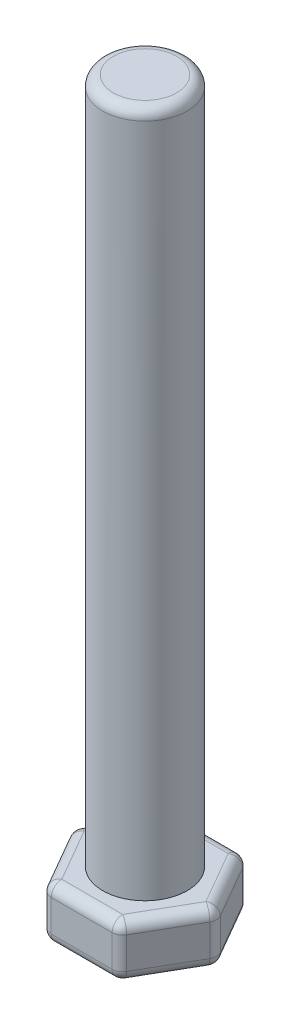
ISO-10303-21;
HEADER;
FILE_DESCRIPTION(('STEP AP214'),'2;1');
FILE_NAME('part.step','',(''),(''),'','','');
FILE_SCHEMA(('AUTOMOTIVE_DESIGN { 1 0 10303 214 1 1 1 1 }'));
ENDSEC;
DATA;
#1=APPLICATION_CONTEXT('core data for automotive mechanical design processes');
#2=APPLICATION_PROTOCOL_DEFINITION('international standard','automotive_design',2000,#1);
#3=PRODUCT_CONTEXT('',#1,'mechanical');
#4=PRODUCT('Part','Part','',(#3));
#5=PRODUCT_RELATED_PRODUCT_CATEGORY('part','',(#4));
#6=PRODUCT_DEFINITION_FORMATION('','',#4);
#7=PRODUCT_DEFINITION_CONTEXT('part definition',#1,'design');
#8=PRODUCT_DEFINITION('design','',#6,#7);
#9=PRODUCT_DEFINITION_SHAPE('','',#8);
#10=(LENGTH_UNIT() NAMED_UNIT(*) SI_UNIT(.MILLI.,.METRE.));
#11=(NAMED_UNIT(*) PLANE_ANGLE_UNIT() SI_UNIT($,.RADIAN.));
#12=(NAMED_UNIT(*) SI_UNIT($,.STERADIAN.) SOLID_ANGLE_UNIT());
#13=UNCERTAINTY_MEASURE_WITH_UNIT(LENGTH_MEASURE(1.E-05),#10,'distance_accuracy_value','');
#14=(GEOMETRIC_REPRESENTATION_CONTEXT(3) GLOBAL_UNCERTAINTY_ASSIGNED_CONTEXT((#13)) GLOBAL_UNIT_ASSIGNED_CONTEXT((#10,
#11,#12)) REPRESENTATION_CONTEXT('',''));
#15=CARTESIAN_POINT('',(0.,0.,0.));
#16=DIRECTION('',(0.,0.,1.));
#17=DIRECTION('',(1.,0.,0.));
#18=AXIS2_PLACEMENT_3D('',#15,#16,#17);
#19=CARTESIAN_POINT('',(0.,65.,0.));
#20=DIRECTION('',(0.,-1.,0.));
#21=DIRECTION('',(0.,0.,-1.));
#22=AXIS2_PLACEMENT_3D('',#19,#20,#21);
#23=CYLINDRICAL_SURFACE('',#22,4.);
#24=CARTESIAN_POINT('',(0.,64.,0.));
#25=DIRECTION('',(0.,1.,0.));
#26=DIRECTION('',(0.,0.,1.));
#27=AXIS2_PLACEMENT_3D('',#24,#25,#26);
#28=CIRCLE('',#27,4.);
#29=CARTESIAN_POINT('',(0.,64.,4.));
#30=VERTEX_POINT('',#29);
#31=EDGE_CURVE('E207',#30,#30,#28,.F.);
#32=ORIENTED_EDGE('',*,*,#31,.T.);
#33=EDGE_LOOP('',(#32));
#34=FACE_BOUND('',#33,.T.);
#35=CARTESIAN_POINT('',(0.,0.,0.));
#36=DIRECTION('',(0.,-1.,0.));
#37=DIRECTION('',(0.,0.,-1.));
#38=AXIS2_PLACEMENT_3D('',#35,#36,#37);
#39=CIRCLE('',#38,4.);
#40=CARTESIAN_POINT('',(0.,0.,-4.));
#41=VERTEX_POINT('',#40);
#42=EDGE_CURVE('E368',#41,#41,#39,.T.);
#43=ORIENTED_EDGE('',*,*,#42,.F.);
#44=EDGE_LOOP('',(#43));
#45=FACE_BOUND('',#44,.T.);
#46=ADVANCED_FACE('F45',(#34,#45),#23,.T.);
#47=CARTESIAN_POINT('',(0.,65.,0.));
#48=DIRECTION('',(0.,1.,0.));
#49=DIRECTION('',(0.,0.,1.));
#50=AXIS2_PLACEMENT_3D('',#47,#48,#49);
#51=PLANE('',#50);
#52=CARTESIAN_POINT('',(0.,65.,0.));
#53=DIRECTION('',(0.,1.,0.));
#54=DIRECTION('',(0.,0.,1.));
#55=AXIS2_PLACEMENT_3D('',#52,#53,#54);
#56=CIRCLE('',#55,3.);
#57=CARTESIAN_POINT('',(0.,65.,3.));
#58=VERTEX_POINT('',#57);
#59=EDGE_CURVE('E210',#58,#58,#56,.T.);
#60=ORIENTED_EDGE('',*,*,#59,.T.);
#61=EDGE_LOOP('',(#60));
#62=FACE_BOUND('',#61,.T.);
#63=ADVANCED_FACE('F380',(#62),#51,.T.);
#64=CARTESIAN_POINT('',(0.,0.,0.));
#65=DIRECTION('',(0.,-1.,0.));
#66=DIRECTION('',(0.,0.,-1.));
#67=AXIS2_PLACEMENT_3D('',#64,#65,#66);
#68=PLANE('',#67);
#69=DIRECTION('',(-0.5,0.,-0.866025403784439));
#70=VECTOR('',#69,1.);
#71=CARTESIAN_POINT('',(-4.3301270189222,0.,2.5));
#72=LINE('',#71,#70);
#73=CARTESIAN_POINT('',(-5.77350269189626,0.,0.));
#74=VERTEX_POINT('',#73);
#75=CARTESIAN_POINT('',(-2.88675134594813,0.,5.));
#76=VERTEX_POINT('',#75);
#77=EDGE_CURVE('E225',#74,#76,#72,.F.);
#78=ORIENTED_EDGE('',*,*,#77,.T.);
#79=DIRECTION('',(-1.,0.,0.));
#80=VECTOR('',#79,1.);
#81=CARTESIAN_POINT('',(0.,0.,5.));
#82=LINE('',#81,#80);
#83=CARTESIAN_POINT('',(2.88675134594813,0.,5.));
#84=VERTEX_POINT('',#83);
#85=EDGE_CURVE('E227',#76,#84,#82,.F.);
#86=ORIENTED_EDGE('',*,*,#85,.T.);
#87=DIRECTION('',(-0.5,0.,0.866025403784438));
#88=VECTOR('',#87,1.);
#89=CARTESIAN_POINT('',(4.33012701892219,0.,2.5));
#90=LINE('',#89,#88);
#91=CARTESIAN_POINT('',(5.77350269189626,0.,0.));
#92=VERTEX_POINT('',#91);
#93=EDGE_CURVE('E220',#84,#92,#90,.F.);
#94=ORIENTED_EDGE('',*,*,#93,.T.);
#95=DIRECTION('',(0.5,0.,0.866025403784439));
#96=VECTOR('',#95,1.);
#97=CARTESIAN_POINT('',(4.33012701892219,0.,-2.5));
#98=LINE('',#97,#96);
#99=CARTESIAN_POINT('',(2.88675134594813,0.,-5.));
#100=VERTEX_POINT('',#99);
#101=EDGE_CURVE('E218',#92,#100,#98,.F.);
#102=ORIENTED_EDGE('',*,*,#101,.T.);
#103=DIRECTION('',(1.,0.,0.));
#104=VECTOR('',#103,1.);
#105=CARTESIAN_POINT('',(0.,0.,-5.));
#106=LINE('',#105,#104);
#107=CARTESIAN_POINT('',(-2.88675134594813,0.,-5.));
#108=VERTEX_POINT('',#107);
#109=EDGE_CURVE('E216',#100,#108,#106,.F.);
#110=ORIENTED_EDGE('',*,*,#109,.T.);
#111=DIRECTION('',(0.5,0.,-0.866025403784439));
#112=VECTOR('',#111,1.);
#113=CARTESIAN_POINT('',(-4.33012701892219,0.,-2.5));
#114=LINE('',#113,#112);
#115=EDGE_CURVE('E222',#108,#74,#114,.F.);
#116=ORIENTED_EDGE('',*,*,#115,.T.);
#117=EDGE_LOOP('',(#78,#86,#94,#102,#110,#116));
#118=FACE_BOUND('',#117,.T.);
#119=ORIENTED_EDGE('',*,*,#42,.T.);
#120=EDGE_LOOP('',(#119));
#121=FACE_BOUND('',#120,.T.);
#122=ADVANCED_FACE('F405',(#118,#121),#68,.F.);
#123=CARTESIAN_POINT('',(-6.92820323027551,-5.,0.));
#124=DIRECTION('',(0.866025403784439,0.,0.5));
#125=DIRECTION('',(0.5,0.,-0.866025403784439));
#126=AXIS2_PLACEMENT_3D('',#123,#124,#125);
#127=PLANE('',#126);
#128=DIRECTION('',(0.5,0.,-0.866025403784439));
#129=VECTOR('',#128,1.);
#130=CARTESIAN_POINT('',(-6.92820323027551,-1.,0.));
#131=LINE('',#130,#129);
#132=CARTESIAN_POINT('',(-6.6395280956807,-1.,-0.500000000000002));
#133=VERTEX_POINT('',#132);
#134=CARTESIAN_POINT('',(-3.75277674973257,-1.,-5.5));
#135=VERTEX_POINT('',#134);
#136=EDGE_CURVE('E181',#133,#135,#131,.T.);
#137=ORIENTED_EDGE('',*,*,#136,.T.);
#138=DIRECTION('',(0.,1.,0.));
#139=VECTOR('',#138,1.);
#140=CARTESIAN_POINT('',(-3.75277674973257,-5.,-5.5));
#141=LINE('',#140,#139);
#142=CARTESIAN_POINT('',(-3.75277674973257,-4.,-5.5));
#143=VERTEX_POINT('',#142);
#144=EDGE_CURVE('E177',#135,#143,#141,.F.);
#145=ORIENTED_EDGE('',*,*,#144,.T.);
#146=DIRECTION('',(0.5,0.,-0.866025403784439));
#147=VECTOR('',#146,1.);
#148=CARTESIAN_POINT('',(-6.92820323027551,-4.,0.));
#149=LINE('',#148,#147);
#150=CARTESIAN_POINT('',(-6.6395280956807,-4.,-0.500000000000002));
#151=VERTEX_POINT('',#150);
#152=EDGE_CURVE('E169',#143,#151,#149,.F.);
#153=ORIENTED_EDGE('',*,*,#152,.T.);
#154=DIRECTION('',(0.,1.,0.));
#155=VECTOR('',#154,1.);
#156=CARTESIAN_POINT('',(-6.6395280956807,-5.,-0.500000000000002));
#157=LINE('',#156,#155);
#158=EDGE_CURVE('E174',#151,#133,#157,.T.);
#159=ORIENTED_EDGE('',*,*,#158,.T.);
#160=EDGE_LOOP('',(#137,#145,#153,#159));
#161=FACE_BOUND('',#160,.T.);
#162=ADVANCED_FACE('F172',(#161),#127,.F.);
#163=CARTESIAN_POINT('',(-3.46410161513775,-5.,-6.));
#164=DIRECTION('',(0.,0.,1.));
#165=DIRECTION('',(1.,0.,0.));
#166=AXIS2_PLACEMENT_3D('',#163,#164,#165);
#167=PLANE('',#166);
#168=DIRECTION('',(1.,0.,0.));
#169=VECTOR('',#168,1.);
#170=CARTESIAN_POINT('',(-3.46410161513775,-4.,-6.));
#171=LINE('',#170,#169);
#172=CARTESIAN_POINT('',(2.88675134594813,-4.,-6.));
#173=VERTEX_POINT('',#172);
#174=CARTESIAN_POINT('',(-2.88675134594813,-4.,-6.));
#175=VERTEX_POINT('',#174);
#176=EDGE_CURVE('E65',#173,#175,#171,.F.);
#177=ORIENTED_EDGE('',*,*,#176,.T.);
#178=DIRECTION('',(0.,1.,0.));
#179=VECTOR('',#178,1.);
#180=CARTESIAN_POINT('',(-2.88675134594813,-5.,-6.));
#181=LINE('',#180,#179);
#182=CARTESIAN_POINT('',(-2.88675134594813,-1.,-6.));
#183=VERTEX_POINT('',#182);
#184=EDGE_CURVE('E11',#175,#183,#181,.T.);
#185=ORIENTED_EDGE('',*,*,#184,.T.);
#186=DIRECTION('',(1.,0.,0.));
#187=VECTOR('',#186,1.);
#188=CARTESIAN_POINT('',(-3.46410161513775,-1.,-6.));
#189=LINE('',#188,#187);
#190=CARTESIAN_POINT('',(2.88675134594813,-1.,-6.));
#191=VERTEX_POINT('',#190);
#192=EDGE_CURVE('E54',#183,#191,#189,.T.);
#193=ORIENTED_EDGE('',*,*,#192,.T.);
#194=DIRECTION('',(0.,1.,0.));
#195=VECTOR('',#194,1.);
#196=CARTESIAN_POINT('',(2.88675134594813,-5.,-6.));
#197=LINE('',#196,#195);
#198=EDGE_CURVE('E276',#191,#173,#197,.F.);
#199=ORIENTED_EDGE('',*,*,#198,.T.);
#200=EDGE_LOOP('',(#177,#185,#193,#199));
#201=FACE_BOUND('',#200,.T.);
#202=ADVANCED_FACE('F411',(#201),#167,.F.);
#203=CARTESIAN_POINT('',(3.46410161513775,-5.,-6.));
#204=DIRECTION('',(-0.866025403784439,0.,0.5));
#205=DIRECTION('',(0.5,0.,0.866025403784439));
#206=AXIS2_PLACEMENT_3D('',#203,#204,#205);
#207=PLANE('',#206);
#208=DIRECTION('',(0.5,0.,0.866025403784439));
#209=VECTOR('',#208,1.);
#210=CARTESIAN_POINT('',(3.46410161513775,-1.,-6.));
#211=LINE('',#210,#209);
#212=CARTESIAN_POINT('',(3.75277674973257,-1.,-5.5));
#213=VERTEX_POINT('',#212);
#214=CARTESIAN_POINT('',(6.63952809568069,-1.,-0.499999999999997));
#215=VERTEX_POINT('',#214);
#216=EDGE_CURVE('E253',#213,#215,#211,.T.);
#217=ORIENTED_EDGE('',*,*,#216,.T.);
#218=DIRECTION('',(0.,1.,0.));
#219=VECTOR('',#218,1.);
#220=CARTESIAN_POINT('',(6.63952809568069,-5.,-0.499999999999996));
#221=LINE('',#220,#219);
#222=CARTESIAN_POINT('',(6.63952809568069,-4.,-0.499999999999997));
#223=VERTEX_POINT('',#222);
#224=EDGE_CURVE('E256',#215,#223,#221,.F.);
#225=ORIENTED_EDGE('',*,*,#224,.T.);
#226=DIRECTION('',(0.5,0.,0.866025403784439));
#227=VECTOR('',#226,1.);
#228=CARTESIAN_POINT('',(3.46410161513775,-4.,-6.));
#229=LINE('',#228,#227);
#230=CARTESIAN_POINT('',(3.75277674973257,-4.,-5.5));
#231=VERTEX_POINT('',#230);
#232=EDGE_CURVE('E251',#223,#231,#229,.F.);
#233=ORIENTED_EDGE('',*,*,#232,.T.);
#234=DIRECTION('',(0.,1.,0.));
#235=VECTOR('',#234,1.);
#236=CARTESIAN_POINT('',(3.75277674973257,-5.,-5.5));
#237=LINE('',#236,#235);
#238=EDGE_CURVE('E249',#231,#213,#237,.T.);
#239=ORIENTED_EDGE('',*,*,#238,.T.);
#240=EDGE_LOOP('',(#217,#225,#233,#239));
#241=FACE_BOUND('',#240,.T.);
#242=ADVANCED_FACE('F414',(#241),#207,.F.);
#243=CARTESIAN_POINT('',(6.92820323027551,-5.,0.));
#244=DIRECTION('',(-0.866025403784438,0.,-0.5));
#245=DIRECTION('',(-0.5,0.,0.866025403784438));
#246=AXIS2_PLACEMENT_3D('',#243,#244,#245);
#247=PLANE('',#246);
#248=DIRECTION('',(-0.5,0.,0.866025403784438));
#249=VECTOR('',#248,1.);
#250=CARTESIAN_POINT('',(6.92820323027551,-4.,0.));
#251=LINE('',#250,#249);
#252=CARTESIAN_POINT('',(3.75277674973257,-4.,5.5));
#253=VERTEX_POINT('',#252);
#254=CARTESIAN_POINT('',(6.63952809568069,-4.,0.500000000000003));
#255=VERTEX_POINT('',#254);
#256=EDGE_CURVE('E231',#253,#255,#251,.F.);
#257=ORIENTED_EDGE('',*,*,#256,.T.);
#258=DIRECTION('',(0.,1.,0.));
#259=VECTOR('',#258,1.);
#260=CARTESIAN_POINT('',(6.63952809568069,-5.,0.500000000000003));
#261=LINE('',#260,#259);
#262=CARTESIAN_POINT('',(6.63952809568069,-1.,0.500000000000003));
#263=VERTEX_POINT('',#262);
#264=EDGE_CURVE('E236',#255,#263,#261,.T.);
#265=ORIENTED_EDGE('',*,*,#264,.T.);
#266=DIRECTION('',(-0.5,0.,0.866025403784438));
#267=VECTOR('',#266,1.);
#268=CARTESIAN_POINT('',(6.92820323027551,-1.,0.));
#269=LINE('',#268,#267);
#270=CARTESIAN_POINT('',(3.75277674973257,-1.,5.5));
#271=VERTEX_POINT('',#270);
#272=EDGE_CURVE('E233',#263,#271,#269,.T.);
#273=ORIENTED_EDGE('',*,*,#272,.T.);
#274=DIRECTION('',(0.,1.,0.));
#275=VECTOR('',#274,1.);
#276=CARTESIAN_POINT('',(3.75277674973256,-5.,5.5));
#277=LINE('',#276,#275);
#278=EDGE_CURVE('E229',#271,#253,#277,.F.);
#279=ORIENTED_EDGE('',*,*,#278,.T.);
#280=EDGE_LOOP('',(#257,#265,#273,#279));
#281=FACE_BOUND('',#280,.T.);
#282=ADVANCED_FACE('F417',(#281),#247,.F.);
#283=CARTESIAN_POINT('',(3.46410161513775,-5.,6.));
#284=DIRECTION('',(0.,0.,-1.));
#285=DIRECTION('',(-1.,0.,0.));
#286=AXIS2_PLACEMENT_3D('',#283,#284,#285);
#287=PLANE('',#286);
#288=DIRECTION('',(-1.,0.,0.));
#289=VECTOR('',#288,1.);
#290=CARTESIAN_POINT('',(3.46410161513775,-4.,6.));
#291=LINE('',#290,#289);
#292=CARTESIAN_POINT('',(-2.88675134594813,-4.,6.));
#293=VERTEX_POINT('',#292);
#294=CARTESIAN_POINT('',(2.88675134594813,-4.,6.));
#295=VERTEX_POINT('',#294);
#296=EDGE_CURVE('E262',#293,#295,#291,.F.);
#297=ORIENTED_EDGE('',*,*,#296,.T.);
#298=DIRECTION('',(0.,1.,0.));
#299=VECTOR('',#298,1.);
#300=CARTESIAN_POINT('',(2.88675134594813,-5.,6.));
#301=LINE('',#300,#299);
#302=CARTESIAN_POINT('',(2.88675134594813,-1.,6.));
#303=VERTEX_POINT('',#302);
#304=EDGE_CURVE('E265',#295,#303,#301,.T.);
#305=ORIENTED_EDGE('',*,*,#304,.T.);
#306=DIRECTION('',(-1.,0.,0.));
#307=VECTOR('',#306,1.);
#308=CARTESIAN_POINT('',(3.46410161513775,-1.,6.));
#309=LINE('',#308,#307);
#310=CARTESIAN_POINT('',(-2.88675134594813,-1.,6.));
#311=VERTEX_POINT('',#310);
#312=EDGE_CURVE('E260',#303,#311,#309,.T.);
#313=ORIENTED_EDGE('',*,*,#312,.T.);
#314=DIRECTION('',(0.,1.,0.));
#315=VECTOR('',#314,1.);
#316=CARTESIAN_POINT('',(-2.88675134594813,-5.,6.));
#317=LINE('',#316,#315);
#318=EDGE_CURVE('E258',#311,#293,#317,.F.);
#319=ORIENTED_EDGE('',*,*,#318,.T.);
#320=EDGE_LOOP('',(#297,#305,#313,#319));
#321=FACE_BOUND('',#320,.T.);
#322=ADVANCED_FACE('F421',(#321),#287,.F.);
#323=CARTESIAN_POINT('',(-3.46410161513776,-5.,6.));
#324=DIRECTION('',(0.866025403784439,0.,-0.5));
#325=DIRECTION('',(-0.5,0.,-0.866025403784439));
#326=AXIS2_PLACEMENT_3D('',#323,#324,#325);
#327=PLANE('',#326);
#328=DIRECTION('',(-0.5,0.,-0.866025403784439));
#329=VECTOR('',#328,1.);
#330=CARTESIAN_POINT('',(-3.46410161513776,-4.,6.));
#331=LINE('',#330,#329);
#332=CARTESIAN_POINT('',(-6.6395280956807,-4.,0.499999999999998));
#333=VERTEX_POINT('',#332);
#334=CARTESIAN_POINT('',(-3.75277674973257,-4.,5.5));
#335=VERTEX_POINT('',#334);
#336=EDGE_CURVE('E269',#333,#335,#331,.F.);
#337=ORIENTED_EDGE('',*,*,#336,.T.);
#338=DIRECTION('',(0.,1.,0.));
#339=VECTOR('',#338,1.);
#340=CARTESIAN_POINT('',(-3.75277674973257,-5.,5.5));
#341=LINE('',#340,#339);
#342=CARTESIAN_POINT('',(-3.75277674973257,-1.,5.5));
#343=VERTEX_POINT('',#342);
#344=EDGE_CURVE('E274',#335,#343,#341,.T.);
#345=ORIENTED_EDGE('',*,*,#344,.T.);
#346=DIRECTION('',(-0.5,0.,-0.866025403784439));
#347=VECTOR('',#346,1.);
#348=CARTESIAN_POINT('',(-3.46410161513776,-1.,6.));
#349=LINE('',#348,#347);
#350=CARTESIAN_POINT('',(-6.6395280956807,-1.,0.499999999999998));
#351=VERTEX_POINT('',#350);
#352=EDGE_CURVE('E271',#343,#351,#349,.T.);
#353=ORIENTED_EDGE('',*,*,#352,.T.);
#354=DIRECTION('',(0.,1.,0.));
#355=VECTOR('',#354,1.);
#356=CARTESIAN_POINT('',(-6.6395280956807,-5.,0.499999999999997));
#357=LINE('',#356,#355);
#358=EDGE_CURVE('E267',#351,#333,#357,.F.);
#359=ORIENTED_EDGE('',*,*,#358,.T.);
#360=EDGE_LOOP('',(#337,#345,#353,#359));
#361=FACE_BOUND('',#360,.T.);
#362=ADVANCED_FACE('F395',(#361),#327,.F.);
#363=CARTESIAN_POINT('',(0.,-5.,0.));
#364=DIRECTION('',(0.,-1.,0.));
#365=DIRECTION('',(0.,0.,-1.));
#366=AXIS2_PLACEMENT_3D('',#363,#364,#365);
#367=PLANE('',#366);
#368=DIRECTION('',(-0.5,0.,0.866025403784438));
#369=VECTOR('',#368,1.);
#370=CARTESIAN_POINT('',(2.59807621135331,-5.,5.5));
#371=LINE('',#370,#369);
#372=CARTESIAN_POINT('',(5.77350269189626,-5.,0.));
#373=VERTEX_POINT('',#372);
#374=CARTESIAN_POINT('',(2.88675134594813,-5.,5.));
#375=VERTEX_POINT('',#374);
#376=EDGE_CURVE('E242',#373,#375,#371,.T.);
#377=ORIENTED_EDGE('',*,*,#376,.T.);
#378=DIRECTION('',(-1.,0.,0.));
#379=VECTOR('',#378,1.);
#380=CARTESIAN_POINT('',(-3.46410161513776,-5.,5.));
#381=LINE('',#380,#379);
#382=CARTESIAN_POINT('',(-2.88675134594813,-5.,5.));
#383=VERTEX_POINT('',#382);
#384=EDGE_CURVE('E247',#375,#383,#381,.T.);
#385=ORIENTED_EDGE('',*,*,#384,.T.);
#386=DIRECTION('',(-0.5,0.,-0.866025403784439));
#387=VECTOR('',#386,1.);
#388=CARTESIAN_POINT('',(-6.06217782649107,-5.,-0.500000000000002));
#389=LINE('',#388,#387);
#390=CARTESIAN_POINT('',(-5.77350269189626,-5.,0.));
#391=VERTEX_POINT('',#390);
#392=EDGE_CURVE('E245',#383,#391,#389,.T.);
#393=ORIENTED_EDGE('',*,*,#392,.T.);
#394=DIRECTION('',(0.5,0.,-0.866025403784439));
#395=VECTOR('',#394,1.);
#396=CARTESIAN_POINT('',(-2.59807621135332,-5.,-5.5));
#397=LINE('',#396,#395);
#398=CARTESIAN_POINT('',(-2.88675134594813,-5.,-5.));
#399=VERTEX_POINT('',#398);
#400=EDGE_CURVE('E189',#391,#399,#397,.T.);
#401=ORIENTED_EDGE('',*,*,#400,.T.);
#402=DIRECTION('',(1.,0.,0.));
#403=VECTOR('',#402,1.);
#404=CARTESIAN_POINT('',(3.46410161513775,-5.,-5.));
#405=LINE('',#404,#403);
#406=CARTESIAN_POINT('',(2.88675134594813,-5.,-5.));
#407=VERTEX_POINT('',#406);
#408=EDGE_CURVE('E238',#399,#407,#405,.T.);
#409=ORIENTED_EDGE('',*,*,#408,.T.);
#410=DIRECTION('',(0.5,0.,0.866025403784439));
#411=VECTOR('',#410,1.);
#412=CARTESIAN_POINT('',(6.06217782649107,-5.,0.500000000000003));
#413=LINE('',#412,#411);
#414=EDGE_CURVE('E240',#407,#373,#413,.T.);
#415=ORIENTED_EDGE('',*,*,#414,.T.);
#416=EDGE_LOOP('',(#377,#385,#393,#401,#409,#415));
#417=FACE_BOUND('',#416,.T.);
#418=ADVANCED_FACE('F384',(#417),#367,.T.);
#419=CARTESIAN_POINT('',(0.,64.,0.));
#420=DIRECTION('',(0.,1.,0.));
#421=DIRECTION('',(0.,0.,1.));
#422=AXIS2_PLACEMENT_3D('',#419,#420,#421);
#423=TOROIDAL_SURFACE('',#422,3.,1.);
#424=ORIENTED_EDGE('',*,*,#31,.F.);
#425=EDGE_LOOP('',(#424));
#426=FACE_BOUND('',#425,.T.);
#427=ORIENTED_EDGE('',*,*,#59,.F.);
#428=EDGE_LOOP('',(#427));
#429=FACE_BOUND('',#428,.T.);
#430=ADVANCED_FACE('F382',(#426,#429),#423,.T.);
#431=CARTESIAN_POINT('',(4.33012701892219,-4.,2.5));
#432=DIRECTION('',(0.5,0.,-0.866025403784438));
#433=DIRECTION('',(-0.866025403784438,0.,-0.5));
#434=AXIS2_PLACEMENT_3D('',#431,#432,#433);
#435=CYLINDRICAL_SURFACE('',#434,1.);
#436=CARTESIAN_POINT('',(2.88675134594813,-4.,5.));
#437=DIRECTION('',(-0.500000000000001,0.,0.866025403784438));
#438=DIRECTION('',(0.866025403784438,0.,0.500000000000001));
#439=AXIS2_PLACEMENT_3D('',#436,#437,#438);
#440=CIRCLE('',#439,1.);
#441=EDGE_CURVE('E49',#375,#253,#440,.T.);
#442=ORIENTED_EDGE('',*,*,#441,.F.);
#443=ORIENTED_EDGE('',*,*,#376,.F.);
#444=CARTESIAN_POINT('',(5.77350269189626,-4.,0.));
#445=DIRECTION('',(0.5,0.,-0.866025403784438));
#446=DIRECTION('',(-0.866025403784438,0.,-0.5));
#447=AXIS2_PLACEMENT_3D('',#444,#445,#446);
#448=CIRCLE('',#447,1.);
#449=EDGE_CURVE('E361',#255,#373,#448,.T.);
#450=ORIENTED_EDGE('',*,*,#449,.F.);
#451=ORIENTED_EDGE('',*,*,#256,.F.);
#452=EDGE_LOOP('',(#442,#443,#450,#451));
#453=FACE_BOUND('',#452,.T.);
#454=ADVANCED_FACE('F47',(#453),#435,.T.);
#455=CARTESIAN_POINT('',(2.88675134594813,-4.,5.));
#456=DIRECTION('',(0.,0.,1.));
#457=DIRECTION('',(1.,0.,0.));
#458=AXIS2_PLACEMENT_3D('',#455,#456,#457);
#459=SPHERICAL_SURFACE('',#458,1.);
#460=CARTESIAN_POINT('',(2.88675134594813,-4.,5.));
#461=DIRECTION('',(1.,0.,0.));
#462=DIRECTION('',(0.,1.,0.));
#463=AXIS2_PLACEMENT_3D('',#460,#461,#462);
#464=CIRCLE('',#463,1.);
#465=EDGE_CURVE('E356',#375,#295,#464,.F.);
#466=ORIENTED_EDGE('',*,*,#465,.F.);
#467=ORIENTED_EDGE('',*,*,#441,.T.);
#468=CARTESIAN_POINT('',(2.88675134594813,-4.,5.));
#469=DIRECTION('',(0.,-1.,0.));
#470=DIRECTION('',(0.,0.,-1.));
#471=AXIS2_PLACEMENT_3D('',#468,#469,#470);
#472=CIRCLE('',#471,1.);
#473=EDGE_CURVE('E359',#295,#253,#472,.F.);
#474=ORIENTED_EDGE('',*,*,#473,.F.);
#475=EDGE_LOOP('',(#466,#467,#474));
#476=FACE_BOUND('',#475,.T.);
#477=ADVANCED_FACE('F392',(#476),#459,.T.);
#478=CARTESIAN_POINT('',(5.77350269189626,-4.,0.));
#479=DIRECTION('',(0.,0.,1.));
#480=DIRECTION('',(1.,0.,0.));
#481=AXIS2_PLACEMENT_3D('',#478,#479,#480);
#482=SPHERICAL_SURFACE('',#481,1.);
#483=CARTESIAN_POINT('',(5.77350269189626,-4.,0.));
#484=DIRECTION('',(0.,-1.,0.));
#485=DIRECTION('',(0.,0.,-1.));
#486=AXIS2_PLACEMENT_3D('',#483,#484,#485);
#487=CIRCLE('',#486,1.);
#488=EDGE_CURVE('E350',#255,#223,#487,.F.);
#489=ORIENTED_EDGE('',*,*,#488,.F.);
#490=ORIENTED_EDGE('',*,*,#449,.T.);
#491=CARTESIAN_POINT('',(5.77350269189626,-4.,0.));
#492=DIRECTION('',(0.5,0.,0.866025403784439));
#493=DIRECTION('',(0.866025403784439,0.,-0.5));
#494=AXIS2_PLACEMENT_3D('',#491,#492,#493);
#495=CIRCLE('',#494,1.);
#496=EDGE_CURVE('E353',#223,#373,#495,.F.);
#497=ORIENTED_EDGE('',*,*,#496,.F.);
#498=EDGE_LOOP('',(#489,#490,#497));
#499=FACE_BOUND('',#498,.T.);
#500=ADVANCED_FACE('F526',(#499),#482,.T.);
#501=CARTESIAN_POINT('',(2.88675134594813,-5.,5.));
#502=DIRECTION('',(0.,1.,0.));
#503=DIRECTION('',(0.,0.,1.));
#504=AXIS2_PLACEMENT_3D('',#501,#502,#503);
#505=CYLINDRICAL_SURFACE('',#504,1.);
#506=ORIENTED_EDGE('',*,*,#473,.T.);
#507=ORIENTED_EDGE('',*,*,#278,.F.);
#508=CARTESIAN_POINT('',(2.88675134594813,-1.,5.));
#509=DIRECTION('',(0.,1.,0.));
#510=DIRECTION('',(0.,0.,1.));
#511=AXIS2_PLACEMENT_3D('',#508,#509,#510);
#512=CIRCLE('',#511,1.);
#513=EDGE_CURVE('E345',#303,#271,#512,.T.);
#514=ORIENTED_EDGE('',*,*,#513,.F.);
#515=ORIENTED_EDGE('',*,*,#304,.F.);
#516=EDGE_LOOP('',(#506,#507,#514,#515));
#517=FACE_BOUND('',#516,.T.);
#518=ADVANCED_FACE('F471',(#517),#505,.T.);
#519=CARTESIAN_POINT('',(0.,-4.,5.));
#520=DIRECTION('',(1.,0.,0.));
#521=DIRECTION('',(0.,0.,-1.));
#522=AXIS2_PLACEMENT_3D('',#519,#520,#521);
#523=CYLINDRICAL_SURFACE('',#522,1.);
#524=ORIENTED_EDGE('',*,*,#465,.T.);
#525=ORIENTED_EDGE('',*,*,#296,.F.);
#526=CARTESIAN_POINT('',(-2.88675134594813,-4.,5.));
#527=DIRECTION('',(-1.,0.,0.));
#528=DIRECTION('',(0.,0.,1.));
#529=AXIS2_PLACEMENT_3D('',#526,#527,#528);
#530=CIRCLE('',#529,1.);
#531=EDGE_CURVE('E342',#383,#293,#530,.T.);
#532=ORIENTED_EDGE('',*,*,#531,.F.);
#533=ORIENTED_EDGE('',*,*,#384,.F.);
#534=EDGE_LOOP('',(#524,#525,#532,#533));
#535=FACE_BOUND('',#534,.T.);
#536=ADVANCED_FACE('F458',(#535),#523,.T.);
#537=CARTESIAN_POINT('',(4.33012701892219,-4.,-2.5));
#538=DIRECTION('',(-0.5,0.,-0.866025403784439));
#539=DIRECTION('',(-0.866025403784439,0.,0.5));
#540=AXIS2_PLACEMENT_3D('',#537,#538,#539);
#541=CYLINDRICAL_SURFACE('',#540,1.);
#542=ORIENTED_EDGE('',*,*,#496,.T.);
#543=ORIENTED_EDGE('',*,*,#414,.F.);
#544=CARTESIAN_POINT('',(2.88675134594813,-4.,-5.));
#545=DIRECTION('',(-0.5,0.,-0.866025403784439));
#546=DIRECTION('',(-0.866025403784439,0.,0.5));
#547=AXIS2_PLACEMENT_3D('',#544,#545,#546);
#548=CIRCLE('',#547,1.);
#549=EDGE_CURVE('E339',#231,#407,#548,.T.);
#550=ORIENTED_EDGE('',*,*,#549,.F.);
#551=ORIENTED_EDGE('',*,*,#232,.F.);
#552=EDGE_LOOP('',(#542,#543,#550,#551));
#553=FACE_BOUND('',#552,.T.);
#554=ADVANCED_FACE('F514',(#553),#541,.T.);
#555=CARTESIAN_POINT('',(5.77350269189626,-5.,0.));
#556=DIRECTION('',(0.,1.,0.));
#557=DIRECTION('',(0.,0.,1.));
#558=AXIS2_PLACEMENT_3D('',#555,#556,#557);
#559=CYLINDRICAL_SURFACE('',#558,1.);
#560=ORIENTED_EDGE('',*,*,#488,.T.);
#561=ORIENTED_EDGE('',*,*,#224,.F.);
#562=CARTESIAN_POINT('',(5.77350269189626,-1.,0.));
#563=DIRECTION('',(0.,1.,0.));
#564=DIRECTION('',(0.,0.,1.));
#565=AXIS2_PLACEMENT_3D('',#562,#563,#564);
#566=CIRCLE('',#565,1.);
#567=EDGE_CURVE('E336',#263,#215,#566,.T.);
#568=ORIENTED_EDGE('',*,*,#567,.F.);
#569=ORIENTED_EDGE('',*,*,#264,.F.);
#570=EDGE_LOOP('',(#560,#561,#568,#569));
#571=FACE_BOUND('',#570,.T.);
#572=ADVANCED_FACE('F525',(#571),#559,.T.);
#573=CARTESIAN_POINT('',(6.06217782649107,-1.,-0.499999999999997));
#574=DIRECTION('',(-0.5,0.,0.866025403784438));
#575=DIRECTION('',(0.866025403784438,0.,0.5));
#576=AXIS2_PLACEMENT_3D('',#573,#574,#575);
#577=CYLINDRICAL_SURFACE('',#576,1.);
#578=CARTESIAN_POINT('',(2.88675134594813,-1.,5.));
#579=DIRECTION('',(-0.5,0.,0.866025403784438));
#580=DIRECTION('',(0.866025403784438,0.,0.5));
#581=AXIS2_PLACEMENT_3D('',#578,#579,#580);
#582=CIRCLE('',#581,1.);
#583=EDGE_CURVE('E347',#271,#84,#582,.T.);
#584=ORIENTED_EDGE('',*,*,#583,.F.);
#585=ORIENTED_EDGE('',*,*,#272,.F.);
#586=CARTESIAN_POINT('',(5.77350269189626,-1.,0.));
#587=DIRECTION('',(0.5,0.,-0.866025403784438));
#588=DIRECTION('',(-0.866025403784439,0.,-0.5));
#589=AXIS2_PLACEMENT_3D('',#586,#587,#588);
#590=CIRCLE('',#589,1.);
#591=EDGE_CURVE('E333',#92,#263,#590,.T.);
#592=ORIENTED_EDGE('',*,*,#591,.F.);
#593=ORIENTED_EDGE('',*,*,#93,.F.);
#594=EDGE_LOOP('',(#584,#585,#592,#593));
#595=FACE_BOUND('',#594,.T.);
#596=ADVANCED_FACE('F478',(#595),#577,.T.);
#597=CARTESIAN_POINT('',(2.88675134594813,-1.,5.));
#598=DIRECTION('',(0.,0.,1.));
#599=DIRECTION('',(1.,0.,0.));
#600=AXIS2_PLACEMENT_3D('',#597,#598,#599);
#601=SPHERICAL_SURFACE('',#600,1.);
#602=ORIENTED_EDGE('',*,*,#513,.T.);
#603=ORIENTED_EDGE('',*,*,#583,.T.);
#604=CARTESIAN_POINT('',(2.88675134594813,-1.,5.));
#605=DIRECTION('',(1.,0.,0.));
#606=DIRECTION('',(0.,0.,-1.));
#607=AXIS2_PLACEMENT_3D('',#604,#605,#606);
#608=CIRCLE('',#607,1.);
#609=EDGE_CURVE('E330',#303,#84,#608,.F.);
#610=ORIENTED_EDGE('',*,*,#609,.F.);
#611=EDGE_LOOP('',(#602,#603,#610));
#612=FACE_BOUND('',#611,.T.);
#613=ADVANCED_FACE('F475',(#612),#601,.T.);
#614=CARTESIAN_POINT('',(-2.88675134594813,-4.,5.));
#615=DIRECTION('',(0.,0.,1.));
#616=DIRECTION('',(1.,0.,0.));
#617=AXIS2_PLACEMENT_3D('',#614,#615,#616);
#618=SPHERICAL_SURFACE('',#617,1.);
#619=CARTESIAN_POINT('',(-2.88675134594813,-4.,5.));
#620=DIRECTION('',(0.5,0.,0.866025403784439));
#621=DIRECTION('',(0.866025403784439,0.,-0.5));
#622=AXIS2_PLACEMENT_3D('',#619,#620,#621);
#623=CIRCLE('',#622,1.);
#624=EDGE_CURVE('E324',#383,#335,#623,.F.);
#625=ORIENTED_EDGE('',*,*,#624,.F.);
#626=ORIENTED_EDGE('',*,*,#531,.T.);
#627=CARTESIAN_POINT('',(-2.88675134594813,-4.,5.));
#628=DIRECTION('',(0.,-1.,0.));
#629=DIRECTION('',(0.,0.,-1.));
#630=AXIS2_PLACEMENT_3D('',#627,#628,#629);
#631=CIRCLE('',#630,1.);
#632=EDGE_CURVE('E327',#335,#293,#631,.F.);
#633=ORIENTED_EDGE('',*,*,#632,.F.);
#634=EDGE_LOOP('',(#625,#626,#633));
#635=FACE_BOUND('',#634,.T.);
#636=ADVANCED_FACE('F462',(#635),#618,.T.);
#637=CARTESIAN_POINT('',(2.88675134594813,-4.,-5.));
#638=DIRECTION('',(0.,0.,1.));
#639=DIRECTION('',(1.,0.,0.));
#640=AXIS2_PLACEMENT_3D('',#637,#638,#639);
#641=SPHERICAL_SURFACE('',#640,1.);
#642=CARTESIAN_POINT('',(2.88675134594813,-4.,-5.));
#643=DIRECTION('',(0.,-1.,0.));
#644=DIRECTION('',(0.,0.,-1.));
#645=AXIS2_PLACEMENT_3D('',#642,#643,#644);
#646=CIRCLE('',#645,1.);
#647=EDGE_CURVE('E318',#231,#173,#646,.F.);
#648=ORIENTED_EDGE('',*,*,#647,.F.);
#649=ORIENTED_EDGE('',*,*,#549,.T.);
#650=CARTESIAN_POINT('',(2.88675134594813,-4.,-5.));
#651=DIRECTION('',(1.,0.,0.));
#652=DIRECTION('',(0.,0.,-1.));
#653=AXIS2_PLACEMENT_3D('',#650,#651,#652);
#654=CIRCLE('',#653,1.);
#655=EDGE_CURVE('E321',#173,#407,#654,.F.);
#656=ORIENTED_EDGE('',*,*,#655,.F.);
#657=EDGE_LOOP('',(#648,#649,#656));
#658=FACE_BOUND('',#657,.T.);
#659=ADVANCED_FACE('F518',(#658),#641,.T.);
#660=CARTESIAN_POINT('',(5.77350269189626,-1.,0.));
#661=DIRECTION('',(0.,0.,1.));
#662=DIRECTION('',(1.,0.,0.));
#663=AXIS2_PLACEMENT_3D('',#660,#661,#662);
#664=SPHERICAL_SURFACE('',#663,1.);
#665=ORIENTED_EDGE('',*,*,#591,.T.);
#666=ORIENTED_EDGE('',*,*,#567,.T.);
#667=CARTESIAN_POINT('',(5.77350269189626,-1.,0.));
#668=DIRECTION('',(0.499999999999999,0.,0.866025403784439));
#669=DIRECTION('',(0.866025403784439,0.,-0.499999999999999));
#670=AXIS2_PLACEMENT_3D('',#667,#668,#669);
#671=CIRCLE('',#670,1.);
#672=EDGE_CURVE('E316',#92,#215,#671,.F.);
#673=ORIENTED_EDGE('',*,*,#672,.F.);
#674=EDGE_LOOP('',(#665,#666,#673));
#675=FACE_BOUND('',#674,.T.);
#676=ADVANCED_FACE('F549',(#675),#664,.T.);
#677=CARTESIAN_POINT('',(3.46410161513775,-1.,5.));
#678=DIRECTION('',(-1.,0.,0.));
#679=DIRECTION('',(0.,0.,1.));
#680=AXIS2_PLACEMENT_3D('',#677,#678,#679);
#681=CYLINDRICAL_SURFACE('',#680,1.);
#682=ORIENTED_EDGE('',*,*,#609,.T.);
#683=ORIENTED_EDGE('',*,*,#85,.F.);
#684=CARTESIAN_POINT('',(-2.88675134594813,-1.,5.));
#685=DIRECTION('',(-1.,0.,0.));
#686=DIRECTION('',(0.,0.,1.));
#687=AXIS2_PLACEMENT_3D('',#684,#685,#686);
#688=CIRCLE('',#687,1.);
#689=EDGE_CURVE('E313',#311,#76,#688,.T.);
#690=ORIENTED_EDGE('',*,*,#689,.F.);
#691=ORIENTED_EDGE('',*,*,#312,.F.);
#692=EDGE_LOOP('',(#682,#683,#690,#691));
#693=FACE_BOUND('',#692,.T.);
#694=ADVANCED_FACE('F440',(#693),#681,.T.);
#695=CARTESIAN_POINT('',(-2.88675134594813,-5.,5.));
#696=DIRECTION('',(0.,1.,0.));
#697=DIRECTION('',(0.,0.,1.));
#698=AXIS2_PLACEMENT_3D('',#695,#696,#697);
#699=CYLINDRICAL_SURFACE('',#698,1.);
#700=ORIENTED_EDGE('',*,*,#632,.T.);
#701=ORIENTED_EDGE('',*,*,#318,.F.);
#702=CARTESIAN_POINT('',(-2.88675134594813,-1.,5.));
#703=DIRECTION('',(0.,1.,0.));
#704=DIRECTION('',(0.,0.,1.));
#705=AXIS2_PLACEMENT_3D('',#702,#703,#704);
#706=CIRCLE('',#705,1.);
#707=EDGE_CURVE('E310',#343,#311,#706,.T.);
#708=ORIENTED_EDGE('',*,*,#707,.F.);
#709=ORIENTED_EDGE('',*,*,#344,.F.);
#710=EDGE_LOOP('',(#700,#701,#708,#709));
#711=FACE_BOUND('',#710,.T.);
#712=ADVANCED_FACE('F453',(#711),#699,.T.);
#713=CARTESIAN_POINT('',(-4.3301270189222,-4.,2.5));
#714=DIRECTION('',(0.5,0.,0.866025403784439));
#715=DIRECTION('',(0.866025403784439,0.,-0.5));
#716=AXIS2_PLACEMENT_3D('',#713,#714,#715);
#717=CYLINDRICAL_SURFACE('',#716,1.);
#718=ORIENTED_EDGE('',*,*,#624,.T.);
#719=ORIENTED_EDGE('',*,*,#336,.F.);
#720=CARTESIAN_POINT('',(-5.77350269189626,-4.,0.));
#721=DIRECTION('',(-0.499999999999999,0.,-0.866025403784439));
#722=DIRECTION('',(-0.866025403784439,0.,0.499999999999999));
#723=AXIS2_PLACEMENT_3D('',#720,#721,#722);
#724=CIRCLE('',#723,1.);
#725=EDGE_CURVE('E193',#391,#333,#724,.T.);
#726=ORIENTED_EDGE('',*,*,#725,.F.);
#727=ORIENTED_EDGE('',*,*,#392,.F.);
#728=EDGE_LOOP('',(#718,#719,#726,#727));
#729=FACE_BOUND('',#728,.T.);
#730=ADVANCED_FACE('F465',(#729),#717,.T.);
#731=CARTESIAN_POINT('',(-4.33012701892219,-4.,-2.5));
#732=DIRECTION('',(-0.5,0.,0.866025403784439));
#733=DIRECTION('',(0.866025403784439,0.,0.5));
#734=AXIS2_PLACEMENT_3D('',#731,#732,#733);
#735=CYLINDRICAL_SURFACE('',#734,1.);
#736=CARTESIAN_POINT('',(-2.88675134594813,-4.,-5.));
#737=DIRECTION('',(0.5,0.,-0.866025403784438));
#738=DIRECTION('',(-0.866025403784439,0.,-0.5));
#739=AXIS2_PLACEMENT_3D('',#736,#737,#738);
#740=CIRCLE('',#739,1.);
#741=EDGE_CURVE('E194',#399,#143,#740,.T.);
#742=ORIENTED_EDGE('',*,*,#741,.F.);
#743=ORIENTED_EDGE('',*,*,#400,.F.);
#744=CARTESIAN_POINT('',(-5.77350269189626,-4.,0.));
#745=DIRECTION('',(-0.5,0.,0.866025403784438));
#746=DIRECTION('',(0.866025403784439,0.,0.5));
#747=AXIS2_PLACEMENT_3D('',#744,#745,#746);
#748=CIRCLE('',#747,1.);
#749=EDGE_CURVE('E185',#151,#391,#748,.T.);
#750=ORIENTED_EDGE('',*,*,#749,.F.);
#751=ORIENTED_EDGE('',*,*,#152,.F.);
#752=EDGE_LOOP('',(#742,#743,#750,#751));
#753=FACE_BOUND('',#752,.T.);
#754=ADVANCED_FACE('F187',(#753),#735,.T.);
#755=CARTESIAN_POINT('',(0.,-4.,-5.));
#756=DIRECTION('',(-1.,0.,0.));
#757=DIRECTION('',(0.,0.,1.));
#758=AXIS2_PLACEMENT_3D('',#755,#756,#757);
#759=CYLINDRICAL_SURFACE('',#758,1.);
#760=ORIENTED_EDGE('',*,*,#655,.T.);
#761=ORIENTED_EDGE('',*,*,#408,.F.);
#762=CARTESIAN_POINT('',(-2.88675134594813,-4.,-5.));
#763=DIRECTION('',(-1.,0.,0.));
#764=DIRECTION('',(0.,-1.,0.));
#765=AXIS2_PLACEMENT_3D('',#762,#763,#764);
#766=CIRCLE('',#765,1.);
#767=EDGE_CURVE('E306',#175,#399,#766,.T.);
#768=ORIENTED_EDGE('',*,*,#767,.F.);
#769=ORIENTED_EDGE('',*,*,#176,.F.);
#770=EDGE_LOOP('',(#760,#761,#768,#769));
#771=FACE_BOUND('',#770,.T.);
#772=ADVANCED_FACE('F510',(#771),#759,.T.);
#773=CARTESIAN_POINT('',(2.88675134594813,-5.,-5.));
#774=DIRECTION('',(0.,1.,0.));
#775=DIRECTION('',(0.,0.,1.));
#776=AXIS2_PLACEMENT_3D('',#773,#774,#775);
#777=CYLINDRICAL_SURFACE('',#776,1.);
#778=ORIENTED_EDGE('',*,*,#647,.T.);
#779=ORIENTED_EDGE('',*,*,#198,.F.);
#780=CARTESIAN_POINT('',(2.88675134594813,-1.,-5.));
#781=DIRECTION('',(0.,1.,0.));
#782=DIRECTION('',(0.,0.,1.));
#783=AXIS2_PLACEMENT_3D('',#780,#781,#782);
#784=CIRCLE('',#783,1.);
#785=EDGE_CURVE('E303',#213,#191,#784,.T.);
#786=ORIENTED_EDGE('',*,*,#785,.F.);
#787=ORIENTED_EDGE('',*,*,#238,.F.);
#788=EDGE_LOOP('',(#778,#779,#786,#787));
#789=FACE_BOUND('',#788,.T.);
#790=ADVANCED_FACE('F521',(#789),#777,.T.);
#791=CARTESIAN_POINT('',(2.59807621135332,-1.,-5.5));
#792=DIRECTION('',(0.5,0.,0.866025403784439));
#793=DIRECTION('',(0.866025403784439,0.,-0.5));
#794=AXIS2_PLACEMENT_3D('',#791,#792,#793);
#795=CYLINDRICAL_SURFACE('',#794,1.);
#796=ORIENTED_EDGE('',*,*,#672,.T.);
#797=ORIENTED_EDGE('',*,*,#216,.F.);
#798=CARTESIAN_POINT('',(2.88675134594813,-1.,-5.));
#799=DIRECTION('',(-0.5,0.,-0.866025403784439));
#800=DIRECTION('',(-0.866025403784439,0.,0.5));
#801=AXIS2_PLACEMENT_3D('',#798,#799,#800);
#802=CIRCLE('',#801,1.);
#803=EDGE_CURVE('E300',#100,#213,#802,.T.);
#804=ORIENTED_EDGE('',*,*,#803,.F.);
#805=ORIENTED_EDGE('',*,*,#101,.F.);
#806=EDGE_LOOP('',(#796,#797,#804,#805));
#807=FACE_BOUND('',#806,.T.);
#808=ADVANCED_FACE('F489',(#807),#795,.T.);
#809=CARTESIAN_POINT('',(-2.88675134594813,-1.,5.));
#810=DIRECTION('',(0.,0.,1.));
#811=DIRECTION('',(1.,0.,0.));
#812=AXIS2_PLACEMENT_3D('',#809,#810,#811);
#813=SPHERICAL_SURFACE('',#812,1.);
#814=ORIENTED_EDGE('',*,*,#707,.T.);
#815=ORIENTED_EDGE('',*,*,#689,.T.);
#816=CARTESIAN_POINT('',(-2.88675134594813,-1.,5.));
#817=DIRECTION('',(0.5,0.,0.866025403784439));
#818=DIRECTION('',(0.866025403784439,0.,-0.5));
#819=AXIS2_PLACEMENT_3D('',#816,#817,#818);
#820=CIRCLE('',#819,1.);
#821=EDGE_CURVE('E201',#343,#76,#820,.F.);
#822=ORIENTED_EDGE('',*,*,#821,.F.);
#823=EDGE_LOOP('',(#814,#815,#822));
#824=FACE_BOUND('',#823,.T.);
#825=ADVANCED_FACE('F445',(#824),#813,.T.);
#826=CARTESIAN_POINT('',(-5.77350269189626,-4.,0.));
#827=DIRECTION('',(0.,0.,1.));
#828=DIRECTION('',(1.,0.,0.));
#829=AXIS2_PLACEMENT_3D('',#826,#827,#828);
#830=SPHERICAL_SURFACE('',#829,1.);
#831=ORIENTED_EDGE('',*,*,#749,.T.);
#832=ORIENTED_EDGE('',*,*,#725,.T.);
#833=CARTESIAN_POINT('',(-5.77350269189626,-4.,0.));
#834=DIRECTION('',(0.,-1.,0.));
#835=DIRECTION('',(0.,0.,-1.));
#836=AXIS2_PLACEMENT_3D('',#833,#834,#835);
#837=CIRCLE('',#836,1.);
#838=EDGE_CURVE('E197',#151,#333,#837,.F.);
#839=ORIENTED_EDGE('',*,*,#838,.F.);
#840=EDGE_LOOP('',(#831,#832,#839));
#841=FACE_BOUND('',#840,.T.);
#842=ADVANCED_FACE('F198',(#841),#830,.T.);
#843=CARTESIAN_POINT('',(-2.88675134594813,-4.,-5.));
#844=DIRECTION('',(0.,0.,1.));
#845=DIRECTION('',(1.,0.,0.));
#846=AXIS2_PLACEMENT_3D('',#843,#844,#845);
#847=SPHERICAL_SURFACE('',#846,1.);
#848=ORIENTED_EDGE('',*,*,#767,.T.);
#849=ORIENTED_EDGE('',*,*,#741,.T.);
#850=CARTESIAN_POINT('',(-2.88675134594813,-4.,-5.));
#851=DIRECTION('',(0.,-1.,0.));
#852=DIRECTION('',(0.,0.,-1.));
#853=AXIS2_PLACEMENT_3D('',#850,#851,#852);
#854=CIRCLE('',#853,1.);
#855=EDGE_CURVE('E202',#175,#143,#854,.F.);
#856=ORIENTED_EDGE('',*,*,#855,.F.);
#857=EDGE_LOOP('',(#848,#849,#856));
#858=FACE_BOUND('',#857,.T.);
#859=ADVANCED_FACE('F507',(#858),#847,.T.);
#860=CARTESIAN_POINT('',(2.88675134594813,-1.,-5.));
#861=DIRECTION('',(0.,0.,1.));
#862=DIRECTION('',(1.,0.,0.));
#863=AXIS2_PLACEMENT_3D('',#860,#861,#862);
#864=SPHERICAL_SURFACE('',#863,1.);
#865=ORIENTED_EDGE('',*,*,#803,.T.);
#866=ORIENTED_EDGE('',*,*,#785,.T.);
#867=CARTESIAN_POINT('',(2.88675134594813,-1.,-5.));
#868=DIRECTION('',(1.,0.,0.));
#869=DIRECTION('',(0.,0.,-1.));
#870=AXIS2_PLACEMENT_3D('',#867,#868,#869);
#871=CIRCLE('',#870,1.);
#872=EDGE_CURVE('E294',#100,#191,#871,.F.);
#873=ORIENTED_EDGE('',*,*,#872,.F.);
#874=EDGE_LOOP('',(#865,#866,#873));
#875=FACE_BOUND('',#874,.T.);
#876=ADVANCED_FACE('F492',(#875),#864,.T.);
#877=CARTESIAN_POINT('',(-2.59807621135332,-1.,5.5));
#878=DIRECTION('',(-0.5,0.,-0.866025403784439));
#879=DIRECTION('',(-0.866025403784439,0.,0.5));
#880=AXIS2_PLACEMENT_3D('',#877,#878,#879);
#881=CYLINDRICAL_SURFACE('',#880,1.);
#882=ORIENTED_EDGE('',*,*,#821,.T.);
#883=ORIENTED_EDGE('',*,*,#77,.F.);
#884=CARTESIAN_POINT('',(-5.77350269189626,-1.,0.));
#885=DIRECTION('',(-0.5,0.,-0.866025403784439));
#886=DIRECTION('',(-0.866025403784439,0.,0.5));
#887=AXIS2_PLACEMENT_3D('',#884,#885,#886);
#888=CIRCLE('',#887,1.);
#889=EDGE_CURVE('E291',#351,#74,#888,.T.);
#890=ORIENTED_EDGE('',*,*,#889,.F.);
#891=ORIENTED_EDGE('',*,*,#352,.F.);
#892=EDGE_LOOP('',(#882,#883,#890,#891));
#893=FACE_BOUND('',#892,.T.);
#894=ADVANCED_FACE('F448',(#893),#881,.T.);
#895=CARTESIAN_POINT('',(-5.77350269189626,-5.,0.));
#896=DIRECTION('',(0.,1.,0.));
#897=DIRECTION('',(0.,0.,1.));
#898=AXIS2_PLACEMENT_3D('',#895,#896,#897);
#899=CYLINDRICAL_SURFACE('',#898,1.);
#900=ORIENTED_EDGE('',*,*,#838,.T.);
#901=ORIENTED_EDGE('',*,*,#358,.F.);
#902=CARTESIAN_POINT('',(-5.77350269189626,-1.,0.));
#903=DIRECTION('',(0.,1.,0.));
#904=DIRECTION('',(0.,0.,1.));
#905=AXIS2_PLACEMENT_3D('',#902,#903,#904);
#906=CIRCLE('',#905,1.);
#907=EDGE_CURVE('E205',#133,#351,#906,.T.);
#908=ORIENTED_EDGE('',*,*,#907,.F.);
#909=ORIENTED_EDGE('',*,*,#158,.F.);
#910=EDGE_LOOP('',(#900,#901,#908,#909));
#911=FACE_BOUND('',#910,.T.);
#912=ADVANCED_FACE('F204',(#911),#899,.T.);
#913=CARTESIAN_POINT('',(-2.88675134594813,-5.,-5.));
#914=DIRECTION('',(0.,1.,0.));
#915=DIRECTION('',(0.,0.,1.));
#916=AXIS2_PLACEMENT_3D('',#913,#914,#915);
#917=CYLINDRICAL_SURFACE('',#916,1.);
#918=ORIENTED_EDGE('',*,*,#855,.T.);
#919=ORIENTED_EDGE('',*,*,#144,.F.);
#920=CARTESIAN_POINT('',(-2.88675134594813,-1.,-5.));
#921=DIRECTION('',(0.,1.,0.));
#922=DIRECTION('',(0.,0.,1.));
#923=AXIS2_PLACEMENT_3D('',#920,#921,#922);
#924=CIRCLE('',#923,1.);
#925=EDGE_CURVE('E287',#183,#135,#924,.T.);
#926=ORIENTED_EDGE('',*,*,#925,.F.);
#927=ORIENTED_EDGE('',*,*,#184,.F.);
#928=EDGE_LOOP('',(#918,#919,#926,#927));
#929=FACE_BOUND('',#928,.T.);
#930=ADVANCED_FACE('F504',(#929),#917,.T.);
#931=CARTESIAN_POINT('',(-3.46410161513775,-1.,-5.));
#932=DIRECTION('',(1.,0.,0.));
#933=DIRECTION('',(0.,0.,-1.));
#934=AXIS2_PLACEMENT_3D('',#931,#932,#933);
#935=CYLINDRICAL_SURFACE('',#934,1.);
#936=ORIENTED_EDGE('',*,*,#872,.T.);
#937=ORIENTED_EDGE('',*,*,#192,.F.);
#938=CARTESIAN_POINT('',(-2.88675134594813,-1.,-5.));
#939=DIRECTION('',(-1.,0.,0.));
#940=DIRECTION('',(0.,0.,1.));
#941=AXIS2_PLACEMENT_3D('',#938,#939,#940);
#942=CIRCLE('',#941,1.);
#943=EDGE_CURVE('E284',#108,#183,#942,.T.);
#944=ORIENTED_EDGE('',*,*,#943,.F.);
#945=ORIENTED_EDGE('',*,*,#109,.F.);
#946=EDGE_LOOP('',(#936,#937,#944,#945));
#947=FACE_BOUND('',#946,.T.);
#948=ADVANCED_FACE('F495',(#947),#935,.T.);
#949=CARTESIAN_POINT('',(-5.77350269189626,-1.,0.));
#950=DIRECTION('',(0.,0.,1.));
#951=DIRECTION('',(1.,0.,0.));
#952=AXIS2_PLACEMENT_3D('',#949,#950,#951);
#953=SPHERICAL_SURFACE('',#952,1.);
#954=ORIENTED_EDGE('',*,*,#907,.T.);
#955=ORIENTED_EDGE('',*,*,#889,.T.);
#956=CARTESIAN_POINT('',(-5.77350269189626,-1.,0.));
#957=DIRECTION('',(-0.5,0.,0.866025403784439));
#958=DIRECTION('',(0.866025403784439,0.,0.5));
#959=AXIS2_PLACEMENT_3D('',#956,#957,#958);
#960=CIRCLE('',#959,1.);
#961=EDGE_CURVE('E282',#133,#74,#960,.F.);
#962=ORIENTED_EDGE('',*,*,#961,.F.);
#963=EDGE_LOOP('',(#954,#955,#962));
#964=FACE_BOUND('',#963,.T.);
#965=ADVANCED_FACE('F583',(#964),#953,.T.);
#966=CARTESIAN_POINT('',(-2.88675134594813,-1.,-5.));
#967=DIRECTION('',(0.,0.,1.));
#968=DIRECTION('',(1.,0.,0.));
#969=AXIS2_PLACEMENT_3D('',#966,#967,#968);
#970=SPHERICAL_SURFACE('',#969,1.);
#971=ORIENTED_EDGE('',*,*,#943,.T.);
#972=ORIENTED_EDGE('',*,*,#925,.T.);
#973=CARTESIAN_POINT('',(-2.88675134594813,-1.,-5.));
#974=DIRECTION('',(0.5,0.,-0.866025403784438));
#975=DIRECTION('',(-0.866025403784438,0.,-0.5));
#976=AXIS2_PLACEMENT_3D('',#973,#974,#975);
#977=CIRCLE('',#976,1.);
#978=EDGE_CURVE('E280',#108,#135,#977,.F.);
#979=ORIENTED_EDGE('',*,*,#978,.F.);
#980=EDGE_LOOP('',(#971,#972,#979));
#981=FACE_BOUND('',#980,.T.);
#982=ADVANCED_FACE('F502',(#981),#970,.T.);
#983=CARTESIAN_POINT('',(-6.06217782649107,-1.,0.499999999999998));
#984=DIRECTION('',(0.5,0.,-0.866025403784439));
#985=DIRECTION('',(-0.866025403784439,0.,-0.5));
#986=AXIS2_PLACEMENT_3D('',#983,#984,#985);
#987=CYLINDRICAL_SURFACE('',#986,1.);
#988=ORIENTED_EDGE('',*,*,#961,.T.);
#989=ORIENTED_EDGE('',*,*,#115,.F.);
#990=ORIENTED_EDGE('',*,*,#978,.T.);
#991=ORIENTED_EDGE('',*,*,#136,.F.);
#992=EDGE_LOOP('',(#988,#989,#990,#991));
#993=FACE_BOUND('',#992,.T.);
#994=ADVANCED_FACE('F500',(#993),#987,.T.);
#995=CLOSED_SHELL('',(#46,#63,#122,#162,#202,#242,#282,#322,#362,#418,#430,#454,#477,#500,#518,
#536,#554,#572,#596,#613,#636,#659,#676,#694,#712,#730,#754,#772,#790,#808,#825,#842,#859,#876,
#894,#912,#930,#948,#965,#982,#994));
#996=MANIFOLD_SOLID_BREP('B2',#995);
#997=ADVANCED_BREP_SHAPE_REPRESENTATION('',(#18,#996),#14);
#998=SHAPE_DEFINITION_REPRESENTATION(#9,#997);
ENDSEC;
END-ISO-10303-21;
